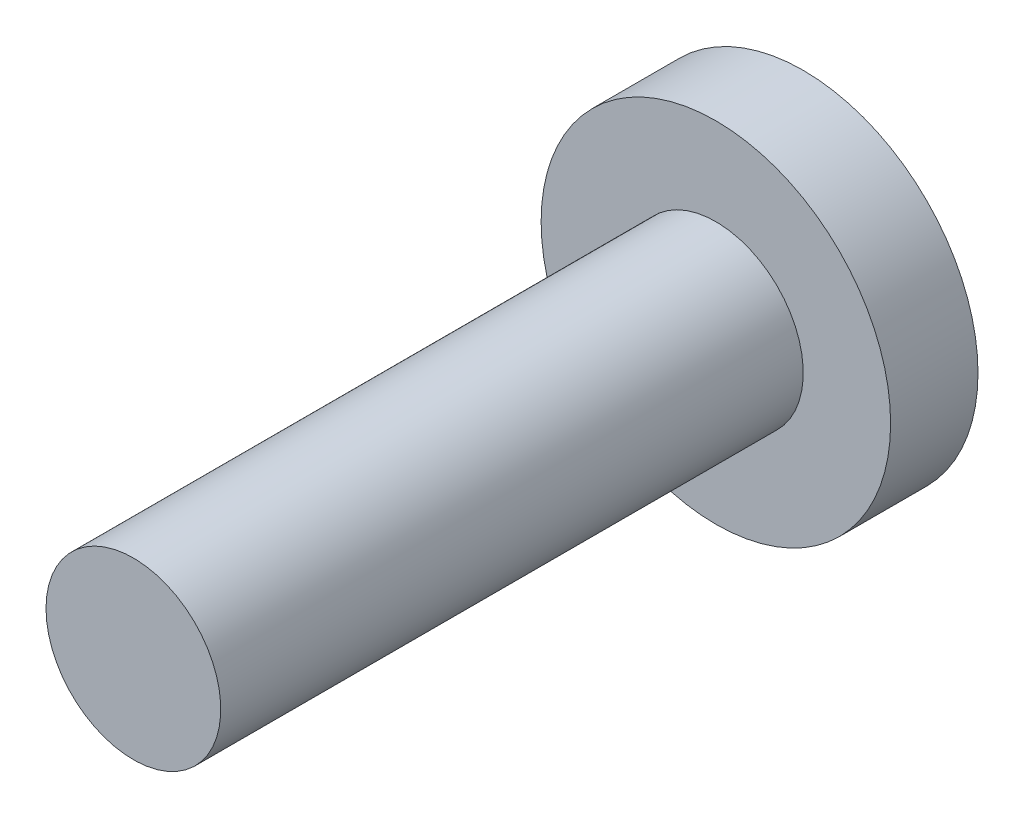
ISO-10303-21;
HEADER;
FILE_DESCRIPTION(('STEP AP214'),'2;1');
FILE_NAME('part.step','',(''),(''),'','','');
FILE_SCHEMA(('AUTOMOTIVE_DESIGN { 1 0 10303 214 1 1 1 1 }'));
ENDSEC;
DATA;
#1=APPLICATION_CONTEXT('core data for automotive mechanical design processes');
#2=APPLICATION_PROTOCOL_DEFINITION('international standard','automotive_design',2000,#1);
#3=PRODUCT_CONTEXT('',#1,'mechanical');
#4=PRODUCT('Part','Part','',(#3));
#5=PRODUCT_RELATED_PRODUCT_CATEGORY('part','',(#4));
#6=PRODUCT_DEFINITION_FORMATION('','',#4);
#7=PRODUCT_DEFINITION_CONTEXT('part definition',#1,'design');
#8=PRODUCT_DEFINITION('design','',#6,#7);
#9=PRODUCT_DEFINITION_SHAPE('','',#8);
#10=(LENGTH_UNIT() NAMED_UNIT(*) SI_UNIT(.MILLI.,.METRE.));
#11=(NAMED_UNIT(*) PLANE_ANGLE_UNIT() SI_UNIT($,.RADIAN.));
#12=(NAMED_UNIT(*) SI_UNIT($,.STERADIAN.) SOLID_ANGLE_UNIT());
#13=UNCERTAINTY_MEASURE_WITH_UNIT(LENGTH_MEASURE(1.E-05),#10,'distance_accuracy_value','');
#14=(GEOMETRIC_REPRESENTATION_CONTEXT(3) GLOBAL_UNCERTAINTY_ASSIGNED_CONTEXT((#13)) GLOBAL_UNIT_ASSIGNED_CONTEXT((#10,
#11,#12)) REPRESENTATION_CONTEXT('',''));
#15=CARTESIAN_POINT('',(0.,0.,0.));
#16=DIRECTION('',(0.,0.,1.));
#17=DIRECTION('',(1.,0.,0.));
#18=AXIS2_PLACEMENT_3D('',#15,#16,#17);
#19=CARTESIAN_POINT('',(27.9574209509427,0.,0.));
#20=DIRECTION('',(0.,0.,1.));
#21=DIRECTION('',(1.,0.,0.));
#22=AXIS2_PLACEMENT_3D('',#19,#20,#21);
#23=PLANE('',#22);
#24=CARTESIAN_POINT('',(27.9574209509427,0.,0.));
#25=DIRECTION('',(0.,0.,1.));
#26=DIRECTION('',(1.,0.,0.));
#27=AXIS2_PLACEMENT_3D('',#24,#25,#26);
#28=CIRCLE('',#27,3.);
#29=CARTESIAN_POINT('',(24.9574209509427,0.,0.));
#30=VERTEX_POINT('',#29);
#31=EDGE_CURVE('E11',#30,#30,#28,.T.);
#32=ORIENTED_EDGE('',*,*,#31,.F.);
#33=EDGE_LOOP('',(#32));
#34=FACE_BOUND('',#33,.T.);
#35=ADVANCED_FACE('F16',(#34),#23,.F.);
#36=CARTESIAN_POINT('',(27.9574209509427,0.,1.5));
#37=DIRECTION('',(0.,0.,1.));
#38=DIRECTION('',(1.,0.,0.));
#39=AXIS2_PLACEMENT_3D('',#36,#37,#38);
#40=PLANE('',#39);
#41=CARTESIAN_POINT('',(27.9574209509427,0.,1.5));
#42=DIRECTION('',(0.,0.,-1.));
#43=DIRECTION('',(1.,0.,0.));
#44=AXIS2_PLACEMENT_3D('',#41,#42,#43);
#45=CIRCLE('',#44,1.5);
#46=CARTESIAN_POINT('',(26.4574209509427,0.,1.5));
#47=VERTEX_POINT('',#46);
#48=EDGE_CURVE('E20',#47,#47,#45,.T.);
#49=ORIENTED_EDGE('',*,*,#48,.T.);
#50=EDGE_LOOP('',(#49));
#51=FACE_BOUND('',#50,.T.);
#52=CARTESIAN_POINT('',(27.9574209509427,0.,1.5));
#53=DIRECTION('',(0.,0.,1.));
#54=DIRECTION('',(1.,0.,0.));
#55=AXIS2_PLACEMENT_3D('',#52,#53,#54);
#56=CIRCLE('',#55,3.);
#57=CARTESIAN_POINT('',(24.9574209509427,0.,1.5));
#58=VERTEX_POINT('',#57);
#59=EDGE_CURVE('E59',#58,#58,#56,.T.);
#60=ORIENTED_EDGE('',*,*,#59,.T.);
#61=EDGE_LOOP('',(#60));
#62=FACE_BOUND('',#61,.T.);
#63=ADVANCED_FACE('F56',(#51,#62),#40,.T.);
#64=CARTESIAN_POINT('',(27.9574209509427,0.,0.));
#65=DIRECTION('',(0.,0.,1.));
#66=DIRECTION('',(1.,0.,0.));
#67=AXIS2_PLACEMENT_3D('',#64,#65,#66);
#68=CYLINDRICAL_SURFACE('',#67,3.);
#69=ORIENTED_EDGE('',*,*,#59,.F.);
#70=DIRECTION('',(0.,0.,-1.));
#71=VECTOR('',#70,1.);
#72=CARTESIAN_POINT('',(24.9574209509427,0.,0.));
#73=LINE('',#72,#71);
#74=EDGE_CURVE('E27',#58,#30,#73,.T.);
#75=ORIENTED_EDGE('',*,*,#74,.T.);
#76=ORIENTED_EDGE('',*,*,#31,.T.);
#77=ORIENTED_EDGE('',*,*,#74,.F.);
#78=EDGE_LOOP('',(#69,#75,#76,#77));
#79=FACE_BOUND('',#78,.T.);
#80=ADVANCED_FACE('F18',(#79),#68,.T.);
#81=CARTESIAN_POINT('',(27.9574209509427,0.,11.5));
#82=DIRECTION('',(0.,0.,1.));
#83=DIRECTION('',(1.,0.,0.));
#84=AXIS2_PLACEMENT_3D('',#81,#82,#83);
#85=PLANE('',#84);
#86=CARTESIAN_POINT('',(27.9574209509427,0.,11.5));
#87=DIRECTION('',(0.,0.,1.));
#88=DIRECTION('',(1.,0.,0.));
#89=AXIS2_PLACEMENT_3D('',#86,#87,#88);
#90=CIRCLE('',#89,1.5);
#91=CARTESIAN_POINT('',(26.4574209509427,0.,11.5));
#92=VERTEX_POINT('',#91);
#93=EDGE_CURVE('E67',#92,#92,#90,.T.);
#94=ORIENTED_EDGE('',*,*,#93,.T.);
#95=EDGE_LOOP('',(#94));
#96=FACE_BOUND('',#95,.T.);
#97=ADVANCED_FACE('F84',(#96),#85,.T.);
#98=CARTESIAN_POINT('',(27.9574209509427,0.,0.));
#99=DIRECTION('',(0.,0.,1.));
#100=DIRECTION('',(1.,0.,0.));
#101=AXIS2_PLACEMENT_3D('',#98,#99,#100);
#102=CYLINDRICAL_SURFACE('',#101,1.5);
#103=ORIENTED_EDGE('',*,*,#93,.F.);
#104=DIRECTION('',(0.,0.,-1.));
#105=VECTOR('',#104,1.);
#106=CARTESIAN_POINT('',(26.4574209509427,0.,0.));
#107=LINE('',#106,#105);
#108=EDGE_CURVE('E49',#92,#47,#107,.T.);
#109=ORIENTED_EDGE('',*,*,#108,.T.);
#110=ORIENTED_EDGE('',*,*,#48,.F.);
#111=ORIENTED_EDGE('',*,*,#108,.F.);
#112=EDGE_LOOP('',(#103,#109,#110,#111));
#113=FACE_BOUND('',#112,.T.);
#114=ADVANCED_FACE('F88',(#113),#102,.T.);
#115=CLOSED_SHELL('',(#35,#63,#80,#97,#114));
#116=MANIFOLD_SOLID_BREP('B1',#115);
#117=ADVANCED_BREP_SHAPE_REPRESENTATION('',(#18,#116),#14);
#118=SHAPE_DEFINITION_REPRESENTATION(#9,#117);
ENDSEC;
END-ISO-10303-21;
